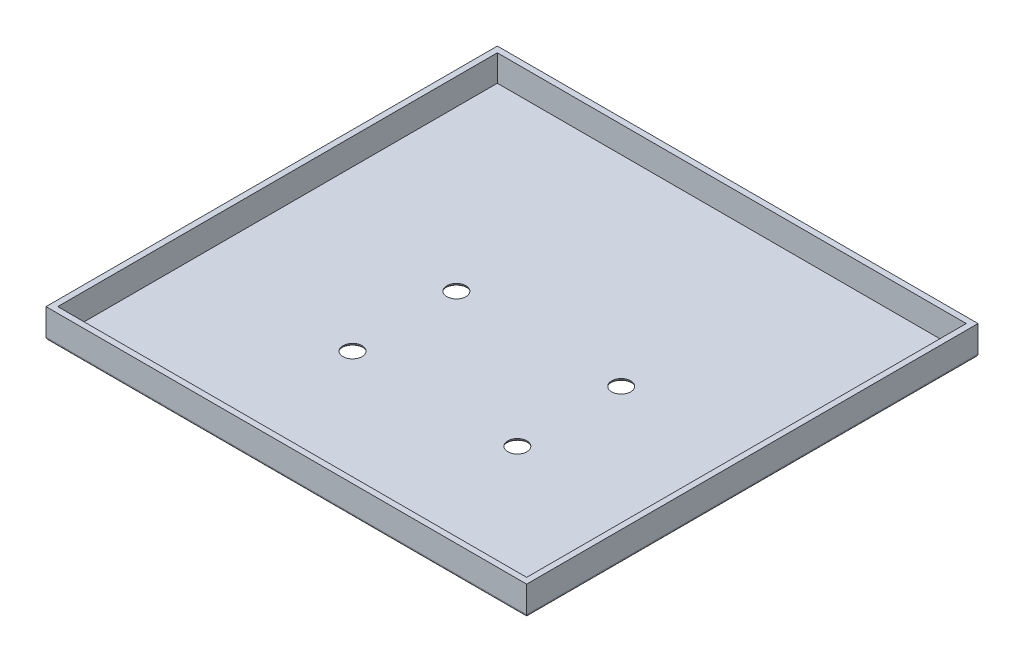
ISO-10303-21;
HEADER;
FILE_DESCRIPTION(('STEP AP214'),'2;1');
FILE_NAME('part.step','',(''),(''),'','','');
FILE_SCHEMA(('AUTOMOTIVE_DESIGN { 1 0 10303 214 1 1 1 1 }'));
ENDSEC;
DATA;
#1=APPLICATION_CONTEXT('core data for automotive mechanical design processes');
#2=APPLICATION_PROTOCOL_DEFINITION('international standard','automotive_design',2000,#1);
#3=PRODUCT_CONTEXT('',#1,'mechanical');
#4=PRODUCT('Part','Part','',(#3));
#5=PRODUCT_RELATED_PRODUCT_CATEGORY('part','',(#4));
#6=PRODUCT_DEFINITION_FORMATION('','',#4);
#7=PRODUCT_DEFINITION_CONTEXT('part definition',#1,'design');
#8=PRODUCT_DEFINITION('design','',#6,#7);
#9=PRODUCT_DEFINITION_SHAPE('','',#8);
#10=(LENGTH_UNIT() NAMED_UNIT(*) SI_UNIT(.MILLI.,.METRE.));
#11=(NAMED_UNIT(*) PLANE_ANGLE_UNIT() SI_UNIT($,.RADIAN.));
#12=(NAMED_UNIT(*) SI_UNIT($,.STERADIAN.) SOLID_ANGLE_UNIT());
#13=UNCERTAINTY_MEASURE_WITH_UNIT(LENGTH_MEASURE(1.E-05),#10,'distance_accuracy_value','');
#14=(GEOMETRIC_REPRESENTATION_CONTEXT(3) GLOBAL_UNCERTAINTY_ASSIGNED_CONTEXT((#13)) GLOBAL_UNIT_ASSIGNED_CONTEXT((#10,
#11,#12)) REPRESENTATION_CONTEXT('',''));
#15=CARTESIAN_POINT('',(0.,0.,0.));
#16=DIRECTION('',(0.,0.,1.));
#17=DIRECTION('',(1.,0.,0.));
#18=AXIS2_PLACEMENT_3D('',#15,#16,#17);
#19=CARTESIAN_POINT('',(0.,10.,0.));
#20=DIRECTION('',(0.,1.,0.));
#21=DIRECTION('',(0.,0.,1.));
#22=AXIS2_PLACEMENT_3D('',#19,#20,#21);
#23=PLANE('',#22);
#24=DIRECTION('',(0.,0.,-1.));
#25=VECTOR('',#24,1.);
#26=CARTESIAN_POINT('',(49.3202247191011,10.,-23.1966292134831));
#27=LINE('',#26,#25);
#28=CARTESIAN_POINT('',(49.3202247191011,10.,126.803370786517));
#29=VERTEX_POINT('',#28);
#30=CARTESIAN_POINT('',(49.3202247191011,10.,-23.1966292134831));
#31=VERTEX_POINT('',#30);
#32=EDGE_CURVE('E131',#29,#31,#27,.T.);
#33=ORIENTED_EDGE('',*,*,#32,.F.);
#34=DIRECTION('',(1.,0.,0.));
#35=VECTOR('',#34,1.);
#36=CARTESIAN_POINT('',(-110.679775280899,10.,126.803370786517));
#37=LINE('',#36,#35);
#38=CARTESIAN_POINT('',(-110.679775280899,10.,126.803370786517));
#39=VERTEX_POINT('',#38);
#40=EDGE_CURVE('E151',#39,#29,#37,.T.);
#41=ORIENTED_EDGE('',*,*,#40,.F.);
#42=DIRECTION('',(0.,0.,1.));
#43=VECTOR('',#42,1.);
#44=CARTESIAN_POINT('',(-110.679775280899,10.,-23.1966292134831));
#45=LINE('',#44,#43);
#46=CARTESIAN_POINT('',(-110.679775280899,10.,-23.1966292134831));
#47=VERTEX_POINT('',#46);
#48=EDGE_CURVE('E155',#47,#39,#45,.T.);
#49=ORIENTED_EDGE('',*,*,#48,.F.);
#50=DIRECTION('',(-1.,0.,0.));
#51=VECTOR('',#50,1.);
#52=CARTESIAN_POINT('',(-110.679775280899,10.,-23.1966292134831));
#53=LINE('',#52,#51);
#54=EDGE_CURVE('E164',#31,#47,#53,.T.);
#55=ORIENTED_EDGE('',*,*,#54,.F.);
#56=EDGE_LOOP('',(#33,#41,#49,#55));
#57=FACE_BOUND('',#56,.T.);
#58=DIRECTION('',(0.,0.,1.));
#59=VECTOR('',#58,1.);
#60=CARTESIAN_POINT('',(-112.679775280899,10.,128.803370786517));
#61=LINE('',#60,#59);
#62=CARTESIAN_POINT('',(-112.679775280899,10.,-25.1966292134831));
#63=VERTEX_POINT('',#62);
#64=CARTESIAN_POINT('',(-112.679775280899,10.,128.803370786517));
#65=VERTEX_POINT('',#64);
#66=EDGE_CURVE('E191',#63,#65,#61,.T.);
#67=ORIENTED_EDGE('',*,*,#66,.T.);
#68=DIRECTION('',(1.,0.,0.));
#69=VECTOR('',#68,1.);
#70=CARTESIAN_POINT('',(51.3202247191011,10.,128.803370786517));
#71=LINE('',#70,#69);
#72=CARTESIAN_POINT('',(51.3202247191011,10.,128.803370786517));
#73=VERTEX_POINT('',#72);
#74=EDGE_CURVE('E195',#65,#73,#71,.T.);
#75=ORIENTED_EDGE('',*,*,#74,.T.);
#76=DIRECTION('',(0.,0.,-1.));
#77=VECTOR('',#76,1.);
#78=CARTESIAN_POINT('',(51.3202247191011,10.,128.803370786517));
#79=LINE('',#78,#77);
#80=CARTESIAN_POINT('',(51.3202247191011,10.,-25.1966292134831));
#81=VERTEX_POINT('',#80);
#82=EDGE_CURVE('E198',#73,#81,#79,.T.);
#83=ORIENTED_EDGE('',*,*,#82,.T.);
#84=DIRECTION('',(-1.,0.,0.));
#85=VECTOR('',#84,1.);
#86=CARTESIAN_POINT('',(51.3202247191011,10.,-25.1966292134831));
#87=LINE('',#86,#85);
#88=EDGE_CURVE('E201',#81,#63,#87,.T.);
#89=ORIENTED_EDGE('',*,*,#88,.T.);
#90=EDGE_LOOP('',(#67,#75,#83,#89));
#91=FACE_BOUND('',#90,.T.);
#92=ADVANCED_FACE('F43',(#57,#91),#23,.T.);
#93=CARTESIAN_POINT('',(0.,0.,0.));
#94=DIRECTION('',(0.,1.,0.));
#95=DIRECTION('',(0.,0.,1.));
#96=AXIS2_PLACEMENT_3D('',#93,#94,#95);
#97=PLANE('',#96);
#98=CARTESIAN_POINT('',(0.,0.,80.6575924405911));
#99=DIRECTION('',(0.,1.,0.));
#100=DIRECTION('',(0.,0.,1.));
#101=AXIS2_PLACEMENT_3D('',#98,#99,#100);
#102=CIRCLE('',#101,4.25);
#103=CARTESIAN_POINT('',(0.,0.,84.9075924405911));
#104=VERTEX_POINT('',#103);
#105=EDGE_CURVE('E245',#104,#104,#102,.T.);
#106=ORIENTED_EDGE('',*,*,#105,.T.);
#107=EDGE_LOOP('',(#106));
#108=FACE_BOUND('',#107,.T.);
#109=CARTESIAN_POINT('',(-56.2295034170842,0.,80.6575924405911));
#110=DIRECTION('',(0.,1.,0.));
#111=DIRECTION('',(0.,0.,1.));
#112=AXIS2_PLACEMENT_3D('',#109,#110,#111);
#113=CIRCLE('',#112,4.25);
#114=CARTESIAN_POINT('',(-56.2295034170842,0.,84.9075924405911));
#115=VERTEX_POINT('',#114);
#116=EDGE_CURVE('E241',#115,#115,#113,.T.);
#117=ORIENTED_EDGE('',*,*,#116,.T.);
#118=EDGE_LOOP('',(#117));
#119=FACE_BOUND('',#118,.T.);
#120=CARTESIAN_POINT('',(0.,0.,45.2236296325278));
#121=DIRECTION('',(0.,1.,0.));
#122=DIRECTION('',(0.,0.,1.));
#123=AXIS2_PLACEMENT_3D('',#120,#121,#122);
#124=CIRCLE('',#123,4.25);
#125=CARTESIAN_POINT('',(0.,0.,49.4736296325278));
#126=VERTEX_POINT('',#125);
#127=EDGE_CURVE('E237',#126,#126,#124,.T.);
#128=ORIENTED_EDGE('',*,*,#127,.T.);
#129=EDGE_LOOP('',(#128));
#130=FACE_BOUND('',#129,.T.);
#131=CARTESIAN_POINT('',(-56.2295034170842,0.,45.2236296325278));
#132=DIRECTION('',(0.,1.,0.));
#133=DIRECTION('',(0.,0.,1.));
#134=AXIS2_PLACEMENT_3D('',#131,#132,#133);
#135=CIRCLE('',#134,4.25);
#136=CARTESIAN_POINT('',(-56.2295034170842,0.,49.4736296325278));
#137=VERTEX_POINT('',#136);
#138=EDGE_CURVE('E233',#137,#137,#135,.T.);
#139=ORIENTED_EDGE('',*,*,#138,.T.);
#140=EDGE_LOOP('',(#139));
#141=FACE_BOUND('',#140,.T.);
#142=DIRECTION('',(0.,0.,-1.));
#143=VECTOR('',#142,1.);
#144=CARTESIAN_POINT('',(50.3202247191011,0.,0.));
#145=LINE('',#144,#143);
#146=CARTESIAN_POINT('',(50.3202247191011,0.,-24.1966292134831));
#147=VERTEX_POINT('',#146);
#148=CARTESIAN_POINT('',(50.3202247191011,0.,127.803370786517));
#149=VERTEX_POINT('',#148);
#150=EDGE_CURVE('E226',#147,#149,#145,.F.);
#151=ORIENTED_EDGE('',*,*,#150,.T.);
#152=DIRECTION('',(1.,0.,0.));
#153=VECTOR('',#152,1.);
#154=CARTESIAN_POINT('',(0.,0.,127.803370786517));
#155=LINE('',#154,#153);
#156=CARTESIAN_POINT('',(-111.679775280899,0.,127.803370786517));
#157=VERTEX_POINT('',#156);
#158=EDGE_CURVE('E229',#149,#157,#155,.F.);
#159=ORIENTED_EDGE('',*,*,#158,.T.);
#160=DIRECTION('',(0.,0.,1.));
#161=VECTOR('',#160,1.);
#162=CARTESIAN_POINT('',(-111.679775280899,0.,0.));
#163=LINE('',#162,#161);
#164=CARTESIAN_POINT('',(-111.679775280899,0.,-24.1966292134831));
#165=VERTEX_POINT('',#164);
#166=EDGE_CURVE('E217',#157,#165,#163,.F.);
#167=ORIENTED_EDGE('',*,*,#166,.T.);
#168=DIRECTION('',(-1.,0.,0.));
#169=VECTOR('',#168,1.);
#170=CARTESIAN_POINT('',(0.,0.,-24.1966292134831));
#171=LINE('',#170,#169);
#172=EDGE_CURVE('E223',#165,#147,#171,.F.);
#173=ORIENTED_EDGE('',*,*,#172,.T.);
#174=EDGE_LOOP('',(#151,#159,#167,#173));
#175=FACE_BOUND('',#174,.T.);
#176=ADVANCED_FACE('F279',(#108,#119,#130,#141,#175),#97,.F.);
#177=CARTESIAN_POINT('',(-112.679775280899,10.,128.803370786517));
#178=DIRECTION('',(1.,0.,0.));
#179=DIRECTION('',(0.,0.,-1.));
#180=AXIS2_PLACEMENT_3D('',#177,#178,#179);
#181=PLANE('',#180);
#182=DIRECTION('',(0.,-1.,0.));
#183=VECTOR('',#182,1.);
#184=CARTESIAN_POINT('',(-112.679775280899,10.,-25.1966292134831));
#185=LINE('',#184,#183);
#186=CARTESIAN_POINT('',(-112.679775280899,0.999999999999999,-25.1966292134831));
#187=VERTEX_POINT('',#186);
#188=EDGE_CURVE('E204',#63,#187,#185,.T.);
#189=ORIENTED_EDGE('',*,*,#188,.T.);
#190=DIRECTION('',(0.,0.,1.));
#191=VECTOR('',#190,1.);
#192=CARTESIAN_POINT('',(-112.679775280899,0.999999999999999,128.803370786517));
#193=LINE('',#192,#191);
#194=CARTESIAN_POINT('',(-112.679775280899,0.999999999999999,128.803370786517));
#195=VERTEX_POINT('',#194);
#196=EDGE_CURVE('E11',#187,#195,#193,.T.);
#197=ORIENTED_EDGE('',*,*,#196,.T.);
#198=DIRECTION('',(0.,-1.,0.));
#199=VECTOR('',#198,1.);
#200=CARTESIAN_POINT('',(-112.679775280899,10.,128.803370786517));
#201=LINE('',#200,#199);
#202=EDGE_CURVE('E213',#65,#195,#201,.T.);
#203=ORIENTED_EDGE('',*,*,#202,.F.);
#204=ORIENTED_EDGE('',*,*,#66,.F.);
#205=EDGE_LOOP('',(#189,#197,#203,#204));
#206=FACE_BOUND('',#205,.T.);
#207=ADVANCED_FACE('F296',(#206),#181,.F.);
#208=CARTESIAN_POINT('',(51.3202247191011,10.,128.803370786517));
#209=DIRECTION('',(0.,0.,-1.));
#210=DIRECTION('',(-1.,0.,0.));
#211=AXIS2_PLACEMENT_3D('',#208,#209,#210);
#212=PLANE('',#211);
#213=ORIENTED_EDGE('',*,*,#202,.T.);
#214=DIRECTION('',(1.,0.,0.));
#215=VECTOR('',#214,1.);
#216=CARTESIAN_POINT('',(51.3202247191011,0.999999999999999,128.803370786517));
#217=LINE('',#216,#215);
#218=CARTESIAN_POINT('',(51.3202247191011,0.999999999999999,128.803370786517));
#219=VERTEX_POINT('',#218);
#220=EDGE_CURVE('E249',#195,#219,#217,.T.);
#221=ORIENTED_EDGE('',*,*,#220,.T.);
#222=DIRECTION('',(0.,-1.,0.));
#223=VECTOR('',#222,1.);
#224=CARTESIAN_POINT('',(51.3202247191011,10.,128.803370786517));
#225=LINE('',#224,#223);
#226=EDGE_CURVE('E210',#73,#219,#225,.T.);
#227=ORIENTED_EDGE('',*,*,#226,.F.);
#228=ORIENTED_EDGE('',*,*,#74,.F.);
#229=EDGE_LOOP('',(#213,#221,#227,#228));
#230=FACE_BOUND('',#229,.T.);
#231=ADVANCED_FACE('F288',(#230),#212,.F.);
#232=CARTESIAN_POINT('',(51.3202247191011,10.,128.803370786517));
#233=DIRECTION('',(-1.,0.,0.));
#234=DIRECTION('',(0.,0.,1.));
#235=AXIS2_PLACEMENT_3D('',#232,#233,#234);
#236=PLANE('',#235);
#237=ORIENTED_EDGE('',*,*,#226,.T.);
#238=DIRECTION('',(0.,0.,-1.));
#239=VECTOR('',#238,1.);
#240=CARTESIAN_POINT('',(51.3202247191011,0.999999999999999,128.803370786517));
#241=LINE('',#240,#239);
#242=CARTESIAN_POINT('',(51.3202247191011,0.999999999999999,-25.1966292134831));
#243=VERTEX_POINT('',#242);
#244=EDGE_CURVE('E68',#219,#243,#241,.T.);
#245=ORIENTED_EDGE('',*,*,#244,.T.);
#246=DIRECTION('',(0.,-1.,0.));
#247=VECTOR('',#246,1.);
#248=CARTESIAN_POINT('',(51.3202247191011,10.,-25.1966292134831));
#249=LINE('',#248,#247);
#250=EDGE_CURVE('E207',#81,#243,#249,.T.);
#251=ORIENTED_EDGE('',*,*,#250,.F.);
#252=ORIENTED_EDGE('',*,*,#82,.F.);
#253=EDGE_LOOP('',(#237,#245,#251,#252));
#254=FACE_BOUND('',#253,.T.);
#255=ADVANCED_FACE('F291',(#254),#236,.F.);
#256=CARTESIAN_POINT('',(51.3202247191011,10.,-25.1966292134831));
#257=DIRECTION('',(0.,0.,1.));
#258=DIRECTION('',(1.,0.,0.));
#259=AXIS2_PLACEMENT_3D('',#256,#257,#258);
#260=PLANE('',#259);
#261=ORIENTED_EDGE('',*,*,#250,.T.);
#262=DIRECTION('',(-1.,0.,0.));
#263=VECTOR('',#262,1.);
#264=CARTESIAN_POINT('',(51.3202247191011,0.999999999999999,-25.1966292134831));
#265=LINE('',#264,#263);
#266=EDGE_CURVE('E53',#243,#187,#265,.T.);
#267=ORIENTED_EDGE('',*,*,#266,.T.);
#268=ORIENTED_EDGE('',*,*,#188,.F.);
#269=ORIENTED_EDGE('',*,*,#88,.F.);
#270=EDGE_LOOP('',(#261,#267,#268,#269));
#271=FACE_BOUND('',#270,.T.);
#272=ADVANCED_FACE('F297',(#271),#260,.F.);
#273=CARTESIAN_POINT('',(49.3202247191011,0.999999999999999,-23.1966292134831));
#274=DIRECTION('',(1.,0.,0.));
#275=DIRECTION('',(0.,0.,-1.));
#276=AXIS2_PLACEMENT_3D('',#273,#274,#275);
#277=PLANE('',#276);
#278=ORIENTED_EDGE('',*,*,#32,.T.);
#279=DIRECTION('',(0.,1.,0.));
#280=VECTOR('',#279,1.);
#281=CARTESIAN_POINT('',(49.3202247191011,0.999999999999999,-23.1966292134831));
#282=LINE('',#281,#280);
#283=CARTESIAN_POINT('',(49.3202247191011,0.999999999999999,-23.1966292134831));
#284=VERTEX_POINT('',#283);
#285=EDGE_CURVE('E124',#284,#31,#282,.T.);
#286=ORIENTED_EDGE('',*,*,#285,.F.);
#287=DIRECTION('',(0.,0.,-1.));
#288=VECTOR('',#287,1.);
#289=CARTESIAN_POINT('',(49.3202247191011,0.999999999999999,-23.1966292134831));
#290=LINE('',#289,#288);
#291=CARTESIAN_POINT('',(49.3202247191011,0.999999999999999,126.803370786517));
#292=VERTEX_POINT('',#291);
#293=EDGE_CURVE('E128',#292,#284,#290,.T.);
#294=ORIENTED_EDGE('',*,*,#293,.F.);
#295=DIRECTION('',(0.,1.,0.));
#296=VECTOR('',#295,1.);
#297=CARTESIAN_POINT('',(49.3202247191011,0.999999999999999,126.803370786517));
#298=LINE('',#297,#296);
#299=EDGE_CURVE('E170',#292,#29,#298,.T.);
#300=ORIENTED_EDGE('',*,*,#299,.T.);
#301=EDGE_LOOP('',(#278,#286,#294,#300));
#302=FACE_BOUND('',#301,.T.);
#303=ADVANCED_FACE('F126',(#302),#277,.F.);
#304=CARTESIAN_POINT('',(-110.679775280899,0.999999999999999,126.803370786517));
#305=DIRECTION('',(0.,0.,1.));
#306=DIRECTION('',(1.,0.,0.));
#307=AXIS2_PLACEMENT_3D('',#304,#305,#306);
#308=PLANE('',#307);
#309=ORIENTED_EDGE('',*,*,#40,.T.);
#310=ORIENTED_EDGE('',*,*,#299,.F.);
#311=DIRECTION('',(1.,0.,0.));
#312=VECTOR('',#311,1.);
#313=CARTESIAN_POINT('',(-110.679775280899,0.999999999999999,126.803370786517));
#314=LINE('',#313,#312);
#315=CARTESIAN_POINT('',(-110.679775280899,0.999999999999999,126.803370786517));
#316=VERTEX_POINT('',#315);
#317=EDGE_CURVE('E137',#316,#292,#314,.T.);
#318=ORIENTED_EDGE('',*,*,#317,.F.);
#319=DIRECTION('',(0.,1.,0.));
#320=VECTOR('',#319,1.);
#321=CARTESIAN_POINT('',(-110.679775280899,0.999999999999999,126.803370786517));
#322=LINE('',#321,#320);
#323=EDGE_CURVE('E174',#316,#39,#322,.T.);
#324=ORIENTED_EDGE('',*,*,#323,.T.);
#325=EDGE_LOOP('',(#309,#310,#318,#324));
#326=FACE_BOUND('',#325,.T.);
#327=ADVANCED_FACE('F304',(#326),#308,.F.);
#328=CARTESIAN_POINT('',(-110.679775280899,0.999999999999999,-23.1966292134831));
#329=DIRECTION('',(-1.,0.,0.));
#330=DIRECTION('',(0.,0.,1.));
#331=AXIS2_PLACEMENT_3D('',#328,#329,#330);
#332=PLANE('',#331);
#333=ORIENTED_EDGE('',*,*,#48,.T.);
#334=ORIENTED_EDGE('',*,*,#323,.F.);
#335=DIRECTION('',(0.,0.,1.));
#336=VECTOR('',#335,1.);
#337=CARTESIAN_POINT('',(-110.679775280899,0.999999999999999,-23.1966292134831));
#338=LINE('',#337,#336);
#339=CARTESIAN_POINT('',(-110.679775280899,0.999999999999999,-23.1966292134831));
#340=VERTEX_POINT('',#339);
#341=EDGE_CURVE('E146',#340,#316,#338,.T.);
#342=ORIENTED_EDGE('',*,*,#341,.F.);
#343=DIRECTION('',(0.,1.,0.));
#344=VECTOR('',#343,1.);
#345=CARTESIAN_POINT('',(-110.679775280899,0.999999999999999,-23.1966292134831));
#346=LINE('',#345,#344);
#347=EDGE_CURVE('E136',#340,#47,#346,.T.);
#348=ORIENTED_EDGE('',*,*,#347,.T.);
#349=EDGE_LOOP('',(#333,#334,#342,#348));
#350=FACE_BOUND('',#349,.T.);
#351=ADVANCED_FACE('F318',(#350),#332,.F.);
#352=CARTESIAN_POINT('',(-110.679775280899,0.999999999999999,-23.1966292134831));
#353=DIRECTION('',(0.,0.,-1.));
#354=DIRECTION('',(-1.,0.,0.));
#355=AXIS2_PLACEMENT_3D('',#352,#353,#354);
#356=PLANE('',#355);
#357=ORIENTED_EDGE('',*,*,#54,.T.);
#358=ORIENTED_EDGE('',*,*,#347,.F.);
#359=DIRECTION('',(-1.,0.,0.));
#360=VECTOR('',#359,1.);
#361=CARTESIAN_POINT('',(-110.679775280899,0.999999999999999,-23.1966292134831));
#362=LINE('',#361,#360);
#363=EDGE_CURVE('E140',#284,#340,#362,.T.);
#364=ORIENTED_EDGE('',*,*,#363,.F.);
#365=ORIENTED_EDGE('',*,*,#285,.T.);
#366=EDGE_LOOP('',(#357,#358,#364,#365));
#367=FACE_BOUND('',#366,.T.);
#368=ADVANCED_FACE('F141',(#367),#356,.F.);
#369=CARTESIAN_POINT('',(0.,0.999999999999999,0.));
#370=DIRECTION('',(0.,1.,0.));
#371=DIRECTION('',(0.,0.,1.));
#372=AXIS2_PLACEMENT_3D('',#369,#370,#371);
#373=PLANE('',#372);
#374=CARTESIAN_POINT('',(-56.2295034170842,0.999999999999999,45.2236296325278));
#375=DIRECTION('',(0.,1.,0.));
#376=DIRECTION('',(0.,0.,1.));
#377=AXIS2_PLACEMENT_3D('',#374,#375,#376);
#378=CIRCLE('',#377,3.25);
#379=CARTESIAN_POINT('',(-56.2295034170842,0.999999999999999,48.4736296325278));
#380=VERTEX_POINT('',#379);
#381=EDGE_CURVE('E187',#380,#380,#378,.T.);
#382=ORIENTED_EDGE('',*,*,#381,.F.);
#383=EDGE_LOOP('',(#382));
#384=FACE_BOUND('',#383,.T.);
#385=CARTESIAN_POINT('',(0.,0.999999999999999,45.2236296325278));
#386=DIRECTION('',(0.,1.,0.));
#387=DIRECTION('',(0.,0.,1.));
#388=AXIS2_PLACEMENT_3D('',#385,#386,#387);
#389=CIRCLE('',#388,3.25);
#390=CARTESIAN_POINT('',(0.,0.999999999999999,48.4736296325278));
#391=VERTEX_POINT('',#390);
#392=EDGE_CURVE('E183',#391,#391,#389,.T.);
#393=ORIENTED_EDGE('',*,*,#392,.F.);
#394=EDGE_LOOP('',(#393));
#395=FACE_BOUND('',#394,.T.);
#396=CARTESIAN_POINT('',(-56.2295034170842,0.999999999999999,80.6575924405911));
#397=DIRECTION('',(0.,1.,0.));
#398=DIRECTION('',(0.,0.,1.));
#399=AXIS2_PLACEMENT_3D('',#396,#397,#398);
#400=CIRCLE('',#399,3.25);
#401=CARTESIAN_POINT('',(-56.2295034170842,0.999999999999999,83.9075924405911));
#402=VERTEX_POINT('',#401);
#403=EDGE_CURVE('E179',#402,#402,#400,.T.);
#404=ORIENTED_EDGE('',*,*,#403,.F.);
#405=EDGE_LOOP('',(#404));
#406=FACE_BOUND('',#405,.T.);
#407=CARTESIAN_POINT('',(0.,0.999999999999999,80.6575924405911));
#408=DIRECTION('',(0.,1.,0.));
#409=DIRECTION('',(0.,0.,1.));
#410=AXIS2_PLACEMENT_3D('',#407,#408,#409);
#411=CIRCLE('',#410,3.25);
#412=CARTESIAN_POINT('',(0.,0.999999999999999,83.9075924405911));
#413=VERTEX_POINT('',#412);
#414=EDGE_CURVE('E173',#413,#413,#411,.T.);
#415=ORIENTED_EDGE('',*,*,#414,.F.);
#416=EDGE_LOOP('',(#415));
#417=FACE_BOUND('',#416,.T.);
#418=ORIENTED_EDGE('',*,*,#293,.T.);
#419=ORIENTED_EDGE('',*,*,#363,.T.);
#420=ORIENTED_EDGE('',*,*,#341,.T.);
#421=ORIENTED_EDGE('',*,*,#317,.T.);
#422=EDGE_LOOP('',(#418,#419,#420,#421));
#423=FACE_BOUND('',#422,.T.);
#424=ADVANCED_FACE('F148',(#384,#395,#406,#417,#423),#373,.T.);
#425=CARTESIAN_POINT('',(0.,0.999999999999999,80.6575924405911));
#426=DIRECTION('',(0.,1.,0.));
#427=DIRECTION('',(0.,0.,1.));
#428=AXIS2_PLACEMENT_3D('',#425,#426,#427);
#429=TOROIDAL_SURFACE('',#428,4.25,1.);
#430=ORIENTED_EDGE('',*,*,#414,.T.);
#431=EDGE_LOOP('',(#430));
#432=FACE_BOUND('',#431,.T.);
#433=ORIENTED_EDGE('',*,*,#105,.F.);
#434=EDGE_LOOP('',(#433));
#435=FACE_BOUND('',#434,.T.);
#436=ADVANCED_FACE('F326',(#432,#435),#429,.T.);
#437=CARTESIAN_POINT('',(-56.2295034170842,0.999999999999999,80.6575924405911));
#438=DIRECTION('',(0.,1.,0.));
#439=DIRECTION('',(0.,0.,1.));
#440=AXIS2_PLACEMENT_3D('',#437,#438,#439);
#441=TOROIDAL_SURFACE('',#440,4.25,1.);
#442=ORIENTED_EDGE('',*,*,#403,.T.);
#443=EDGE_LOOP('',(#442));
#444=FACE_BOUND('',#443,.T.);
#445=ORIENTED_EDGE('',*,*,#116,.F.);
#446=EDGE_LOOP('',(#445));
#447=FACE_BOUND('',#446,.T.);
#448=ADVANCED_FACE('F331',(#444,#447),#441,.T.);
#449=CARTESIAN_POINT('',(0.,0.999999999999999,45.2236296325278));
#450=DIRECTION('',(0.,1.,0.));
#451=DIRECTION('',(0.,0.,1.));
#452=AXIS2_PLACEMENT_3D('',#449,#450,#451);
#453=TOROIDAL_SURFACE('',#452,4.25,1.);
#454=ORIENTED_EDGE('',*,*,#392,.T.);
#455=EDGE_LOOP('',(#454));
#456=FACE_BOUND('',#455,.T.);
#457=ORIENTED_EDGE('',*,*,#127,.F.);
#458=EDGE_LOOP('',(#457));
#459=FACE_BOUND('',#458,.T.);
#460=ADVANCED_FACE('F352',(#456,#459),#453,.T.);
#461=CARTESIAN_POINT('',(-56.2295034170842,0.999999999999999,45.2236296325278));
#462=DIRECTION('',(0.,1.,0.));
#463=DIRECTION('',(0.,0.,1.));
#464=AXIS2_PLACEMENT_3D('',#461,#462,#463);
#465=TOROIDAL_SURFACE('',#464,4.25,1.);
#466=ORIENTED_EDGE('',*,*,#381,.T.);
#467=EDGE_LOOP('',(#466));
#468=FACE_BOUND('',#467,.T.);
#469=ORIENTED_EDGE('',*,*,#138,.F.);
#470=EDGE_LOOP('',(#469));
#471=FACE_BOUND('',#470,.T.);
#472=ADVANCED_FACE('F350',(#468,#471),#465,.T.);
#473=CARTESIAN_POINT('',(51.3202247191011,0.999999999999999,-24.1966292134831));
#474=DIRECTION('',(-1.,0.,0.));
#475=DIRECTION('',(0.,0.,1.));
#476=AXIS2_PLACEMENT_3D('',#473,#474,#475);
#477=CYLINDRICAL_SURFACE('',#476,1.);
#478=CARTESIAN_POINT('',(50.3202247191011,0.999999999999999,-24.1966292134831));
#479=DIRECTION('',(-0.707106781186548,0.,-0.707106781186547));
#480=DIRECTION('',(-0.707106781186547,0.,0.707106781186548));
#481=AXIS2_PLACEMENT_3D('',#478,#479,#480);
#482=ELLIPSE('',#481,1.4142135623731,1.);
#483=EDGE_CURVE('E262',#147,#243,#482,.F.);
#484=ORIENTED_EDGE('',*,*,#483,.F.);
#485=ORIENTED_EDGE('',*,*,#172,.F.);
#486=CARTESIAN_POINT('',(-111.679775280899,0.999999999999999,-24.1966292134831));
#487=DIRECTION('',(-0.707106781186547,0.,0.707106781186548));
#488=DIRECTION('',(0.707106781186548,0.,0.707106781186547));
#489=AXIS2_PLACEMENT_3D('',#486,#487,#488);
#490=ELLIPSE('',#489,1.41421356237309,1.);
#491=EDGE_CURVE('E47',#187,#165,#490,.T.);
#492=ORIENTED_EDGE('',*,*,#491,.F.);
#493=ORIENTED_EDGE('',*,*,#266,.F.);
#494=EDGE_LOOP('',(#484,#485,#492,#493));
#495=FACE_BOUND('',#494,.T.);
#496=ADVANCED_FACE('F45',(#495),#477,.T.);
#497=CARTESIAN_POINT('',(-111.679775280899,0.999999999999999,128.803370786517));
#498=DIRECTION('',(0.,0.,1.));
#499=DIRECTION('',(1.,0.,0.));
#500=AXIS2_PLACEMENT_3D('',#497,#498,#499);
#501=CYLINDRICAL_SURFACE('',#500,1.);
#502=ORIENTED_EDGE('',*,*,#491,.T.);
#503=ORIENTED_EDGE('',*,*,#166,.F.);
#504=CARTESIAN_POINT('',(-111.679775280899,0.999999999999999,127.803370786517));
#505=DIRECTION('',(0.707106781186548,0.,0.707106781186547));
#506=DIRECTION('',(-0.707106781186547,0.,0.707106781186548));
#507=AXIS2_PLACEMENT_3D('',#504,#505,#506);
#508=ELLIPSE('',#507,1.4142135623731,1.);
#509=EDGE_CURVE('E260',#195,#157,#508,.T.);
#510=ORIENTED_EDGE('',*,*,#509,.F.);
#511=ORIENTED_EDGE('',*,*,#196,.F.);
#512=EDGE_LOOP('',(#502,#503,#510,#511));
#513=FACE_BOUND('',#512,.T.);
#514=ADVANCED_FACE('F274',(#513),#501,.T.);
#515=CARTESIAN_POINT('',(50.3202247191011,0.999999999999999,128.803370786517));
#516=DIRECTION('',(0.,0.,-1.));
#517=DIRECTION('',(-1.,0.,0.));
#518=AXIS2_PLACEMENT_3D('',#515,#516,#517);
#519=CYLINDRICAL_SURFACE('',#518,1.);
#520=ORIENTED_EDGE('',*,*,#483,.T.);
#521=ORIENTED_EDGE('',*,*,#244,.F.);
#522=CARTESIAN_POINT('',(50.3202247191011,0.999999999999999,127.803370786517));
#523=DIRECTION('',(0.707106781186547,0.,-0.707106781186548));
#524=DIRECTION('',(-0.707106781186548,0.,-0.707106781186547));
#525=AXIS2_PLACEMENT_3D('',#522,#523,#524);
#526=ELLIPSE('',#525,1.41421356237309,1.);
#527=EDGE_CURVE('E257',#149,#219,#526,.F.);
#528=ORIENTED_EDGE('',*,*,#527,.F.);
#529=ORIENTED_EDGE('',*,*,#150,.F.);
#530=EDGE_LOOP('',(#520,#521,#528,#529));
#531=FACE_BOUND('',#530,.T.);
#532=ADVANCED_FACE('F285',(#531),#519,.T.);
#533=CARTESIAN_POINT('',(51.3202247191011,0.999999999999999,127.803370786517));
#534=DIRECTION('',(1.,0.,0.));
#535=DIRECTION('',(0.,0.,-1.));
#536=AXIS2_PLACEMENT_3D('',#533,#534,#535);
#537=CYLINDRICAL_SURFACE('',#536,1.);
#538=ORIENTED_EDGE('',*,*,#509,.T.);
#539=ORIENTED_EDGE('',*,*,#158,.F.);
#540=ORIENTED_EDGE('',*,*,#527,.T.);
#541=ORIENTED_EDGE('',*,*,#220,.F.);
#542=EDGE_LOOP('',(#538,#539,#540,#541));
#543=FACE_BOUND('',#542,.T.);
#544=ADVANCED_FACE('F283',(#543),#537,.T.);
#545=CLOSED_SHELL('',(#92,#176,#207,#231,#255,#272,#303,#327,#351,#368,#424,#436,#448,#460,#472,
#496,#514,#532,#544));
#546=MANIFOLD_SOLID_BREP('B2',#545);
#547=ADVANCED_BREP_SHAPE_REPRESENTATION('',(#18,#546),#14);
#548=SHAPE_DEFINITION_REPRESENTATION(#9,#547);
ENDSEC;
END-ISO-10303-21;
